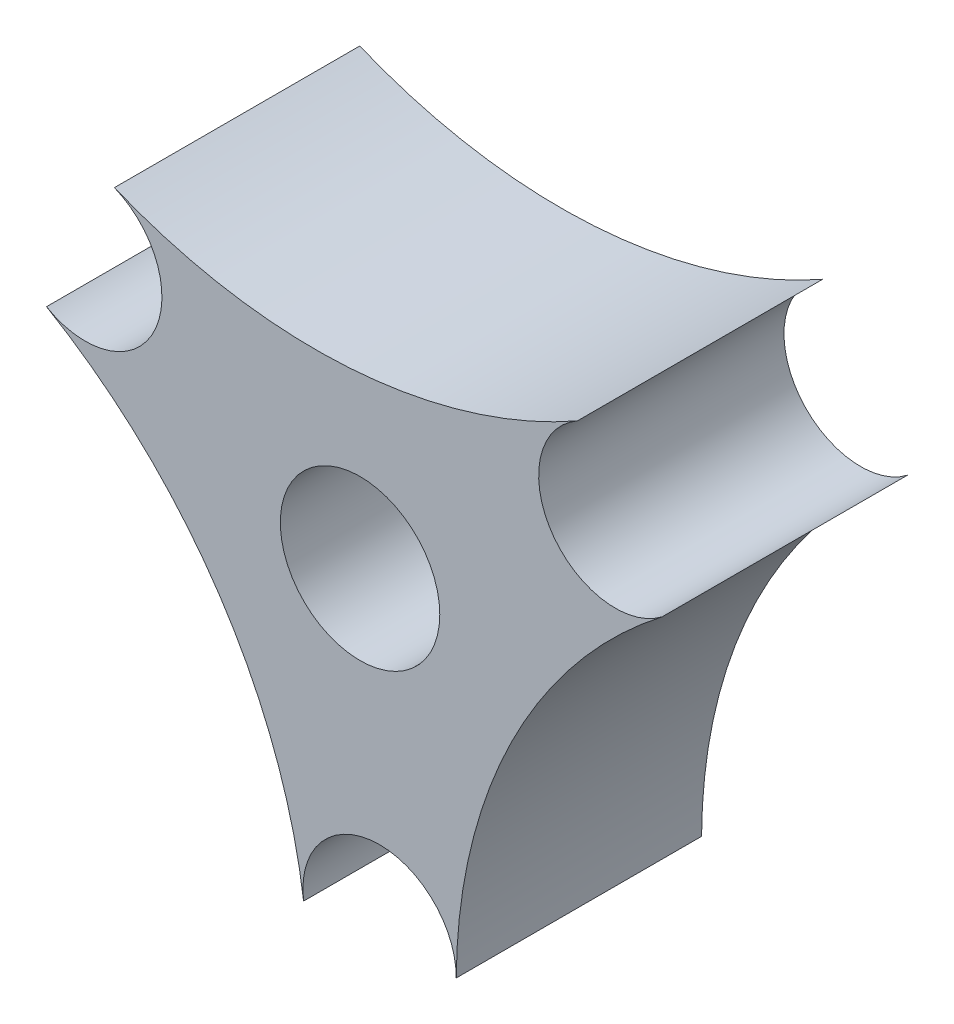
ISO-10303-21;
HEADER;
FILE_DESCRIPTION(('STEP AP214'),'2;1');
FILE_NAME('part.step','',(''),(''),'','','');
FILE_SCHEMA(('AUTOMOTIVE_DESIGN { 1 0 10303 214 1 1 1 1 }'));
ENDSEC;
DATA;
#1=APPLICATION_CONTEXT('core data for automotive mechanical design processes');
#2=APPLICATION_PROTOCOL_DEFINITION('international standard','automotive_design',2000,#1);
#3=PRODUCT_CONTEXT('',#1,'mechanical');
#4=PRODUCT('Part','Part','',(#3));
#5=PRODUCT_RELATED_PRODUCT_CATEGORY('part','',(#4));
#6=PRODUCT_DEFINITION_FORMATION('','',#4);
#7=PRODUCT_DEFINITION_CONTEXT('part definition',#1,'design');
#8=PRODUCT_DEFINITION('design','',#6,#7);
#9=PRODUCT_DEFINITION_SHAPE('','',#8);
#10=(LENGTH_UNIT() NAMED_UNIT(*) SI_UNIT(.MILLI.,.METRE.));
#11=(NAMED_UNIT(*) PLANE_ANGLE_UNIT() SI_UNIT($,.RADIAN.));
#12=(NAMED_UNIT(*) SI_UNIT($,.STERADIAN.) SOLID_ANGLE_UNIT());
#13=UNCERTAINTY_MEASURE_WITH_UNIT(LENGTH_MEASURE(1.E-05),#10,'distance_accuracy_value','');
#14=(GEOMETRIC_REPRESENTATION_CONTEXT(3) GLOBAL_UNCERTAINTY_ASSIGNED_CONTEXT((#13)) GLOBAL_UNIT_ASSIGNED_CONTEXT((#10,
#11,#12)) REPRESENTATION_CONTEXT('',''));
#15=CARTESIAN_POINT('',(0.,0.,0.));
#16=DIRECTION('',(0.,0.,1.));
#17=DIRECTION('',(1.,0.,0.));
#18=AXIS2_PLACEMENT_3D('',#15,#16,#17);
#19=CARTESIAN_POINT('',(408.244515982994,-202.20827326618,160.));
#20=DIRECTION('',(0.,0.,-1.));
#21=DIRECTION('',(-1.,0.,0.));
#22=AXIS2_PLACEMENT_3D('',#19,#20,#21);
#23=CYLINDRICAL_SURFACE('',#22,345.52);
#24=CARTESIAN_POINT('',(408.244515982994,-202.20827326618,0.));
#25=DIRECTION('',(0.,0.,1.));
#26=DIRECTION('',(1.,0.,0.));
#27=AXIS2_PLACEMENT_3D('',#24,#25,#26);
#28=CIRCLE('',#27,345.52);
#29=CARTESIAN_POINT('',(197.049087255945,71.2520735572632,0.));
#30=VERTEX_POINT('',#29);
#31=CARTESIAN_POINT('',(62.7320621801279,-199.924708701148,0.));
#32=VERTEX_POINT('',#31);
#33=EDGE_CURVE('E122',#30,#32,#28,.T.);
#34=ORIENTED_EDGE('',*,*,#33,.F.);
#35=DIRECTION('',(0.,0.,-1.));
#36=VECTOR('',#35,1.);
#37=CARTESIAN_POINT('',(197.049087255945,71.2520735572632,160.));
#38=LINE('',#37,#36);
#39=CARTESIAN_POINT('',(197.049087255945,71.2520735572632,160.));
#40=VERTEX_POINT('',#39);
#41=EDGE_CURVE('E11',#40,#30,#38,.T.);
#42=ORIENTED_EDGE('',*,*,#41,.F.);
#43=CARTESIAN_POINT('',(408.244515982994,-202.20827326618,160.));
#44=DIRECTION('',(0.,0.,1.));
#45=DIRECTION('',(1.,0.,0.));
#46=AXIS2_PLACEMENT_3D('',#43,#44,#45);
#47=CIRCLE('',#46,345.52);
#48=CARTESIAN_POINT('',(62.7320621801279,-199.924708701148,160.));
#49=VERTEX_POINT('',#48);
#50=EDGE_CURVE('E244',#40,#49,#47,.T.);
#51=ORIENTED_EDGE('',*,*,#50,.T.);
#52=DIRECTION('',(0.,0.,-1.));
#53=VECTOR('',#52,1.);
#54=CARTESIAN_POINT('',(62.7320621801279,-199.924708701148,160.));
#55=LINE('',#54,#53);
#56=EDGE_CURVE('E54',#49,#32,#55,.T.);
#57=ORIENTED_EDGE('',*,*,#56,.T.);
#58=EDGE_LOOP('',(#34,#42,#51,#57));
#59=FACE_BOUND('',#58,.T.);
#60=ADVANCED_FACE('F37',(#59),#23,.F.);
#61=CARTESIAN_POINT('',(166.487118523737,110.824362690084,160.));
#62=DIRECTION('',(0.,0.,-1.));
#63=DIRECTION('',(-1.,0.,0.));
#64=AXIS2_PLACEMENT_3D('',#61,#62,#63);
#65=CYLINDRICAL_SURFACE('',#64,50.);
#66=CARTESIAN_POINT('',(166.487118523737,110.824362690084,0.));
#67=DIRECTION('',(0.,0.,1.));
#68=DIRECTION('',(1.,0.,0.));
#69=AXIS2_PLACEMENT_3D('',#66,#67,#68);
#70=CIRCLE('',#69,50.);
#71=CARTESIAN_POINT('',(141.773845489334,154.28991383035,0.));
#72=VERTEX_POINT('',#71);
#73=EDGE_CURVE('E124',#72,#30,#70,.T.);
#74=ORIENTED_EDGE('',*,*,#73,.F.);
#75=DIRECTION('',(0.,0.,-1.));
#76=VECTOR('',#75,1.);
#77=CARTESIAN_POINT('',(141.773845489334,154.28991383035,160.));
#78=LINE('',#77,#76);
#79=CARTESIAN_POINT('',(141.773845489334,154.28991383035,160.));
#80=VERTEX_POINT('',#79);
#81=EDGE_CURVE('E46',#80,#72,#78,.T.);
#82=ORIENTED_EDGE('',*,*,#81,.F.);
#83=CARTESIAN_POINT('',(166.487118523737,110.824362690084,160.));
#84=DIRECTION('',(0.,0.,1.));
#85=DIRECTION('',(1.,0.,0.));
#86=AXIS2_PLACEMENT_3D('',#83,#84,#85);
#87=CIRCLE('',#86,50.);
#88=EDGE_CURVE('E246',#80,#40,#87,.T.);
#89=ORIENTED_EDGE('',*,*,#88,.T.);
#90=ORIENTED_EDGE('',*,*,#41,.T.);
#91=EDGE_LOOP('',(#74,#82,#89,#90));
#92=FACE_BOUND('',#91,.T.);
#93=ADVANCED_FACE('F145',(#92),#65,.F.);
#94=CARTESIAN_POINT('',(-29.0047564875989,454.654258430045,160.));
#95=DIRECTION('',(0.,0.,-1.));
#96=DIRECTION('',(-1.,0.,0.));
#97=AXIS2_PLACEMENT_3D('',#94,#95,#96);
#98=CYLINDRICAL_SURFACE('',#97,345.52);
#99=CARTESIAN_POINT('',(-29.0047564875989,454.654258430045,0.));
#100=DIRECTION('',(0.,0.,1.));
#101=DIRECTION('',(1.,0.,0.));
#102=AXIS2_PLACEMENT_3D('',#99,#100,#101);
#103=CIRCLE('',#102,345.52);
#104=CARTESIAN_POINT('',(-160.23064940088,135.023478577553,0.));
#105=VERTEX_POINT('',#104);
#106=EDGE_CURVE('E127',#105,#72,#103,.T.);
#107=ORIENTED_EDGE('',*,*,#106,.F.);
#108=DIRECTION('',(0.,0.,-1.));
#109=VECTOR('',#108,1.);
#110=CARTESIAN_POINT('',(-160.23064940088,135.023478577553,160.));
#111=LINE('',#110,#109);
#112=CARTESIAN_POINT('',(-160.23064940088,135.023478577553,160.));
#113=VERTEX_POINT('',#112);
#114=EDGE_CURVE('E101',#113,#105,#111,.T.);
#115=ORIENTED_EDGE('',*,*,#114,.F.);
#116=CARTESIAN_POINT('',(-29.0047564875989,454.654258430045,160.));
#117=DIRECTION('',(0.,0.,1.));
#118=DIRECTION('',(1.,0.,0.));
#119=AXIS2_PLACEMENT_3D('',#116,#117,#118);
#120=CIRCLE('',#119,345.52);
#121=EDGE_CURVE('E111',#113,#80,#120,.T.);
#122=ORIENTED_EDGE('',*,*,#121,.T.);
#123=ORIENTED_EDGE('',*,*,#81,.T.);
#124=EDGE_LOOP('',(#107,#115,#122,#123));
#125=FACE_BOUND('',#124,.T.);
#126=ADVANCED_FACE('F142',(#125),#98,.F.);
#127=CARTESIAN_POINT('',(-179.220272709701,88.7698926993848,160.));
#128=DIRECTION('',(0.,0.,-1.));
#129=DIRECTION('',(-1.,0.,0.));
#130=AXIS2_PLACEMENT_3D('',#127,#128,#129);
#131=CYLINDRICAL_SURFACE('',#130,50.);
#132=CARTESIAN_POINT('',(-179.220272709701,88.7698926993848,0.));
#133=DIRECTION('',(0.,0.,1.));
#134=DIRECTION('',(1.,0.,0.));
#135=AXIS2_PLACEMENT_3D('',#132,#133,#134);
#136=CIRCLE('',#135,50.);
#137=CARTESIAN_POINT('',(-204.505907669462,45.6347948707985,0.));
#138=VERTEX_POINT('',#137);
#139=EDGE_CURVE('E97',#138,#105,#136,.T.);
#140=ORIENTED_EDGE('',*,*,#139,.F.);
#141=DIRECTION('',(0.,0.,-1.));
#142=VECTOR('',#141,1.);
#143=CARTESIAN_POINT('',(-204.505907669462,45.6347948707985,160.));
#144=LINE('',#143,#142);
#145=CARTESIAN_POINT('',(-204.505907669462,45.6347948707985,160.));
#146=VERTEX_POINT('',#145);
#147=EDGE_CURVE('E92',#146,#138,#144,.T.);
#148=ORIENTED_EDGE('',*,*,#147,.F.);
#149=CARTESIAN_POINT('',(-179.220272709701,88.7698926993848,160.));
#150=DIRECTION('',(0.,0.,1.));
#151=DIRECTION('',(1.,0.,0.));
#152=AXIS2_PLACEMENT_3D('',#149,#150,#151);
#153=CIRCLE('',#152,50.);
#154=EDGE_CURVE('E95',#146,#113,#153,.T.);
#155=ORIENTED_EDGE('',*,*,#154,.T.);
#156=ORIENTED_EDGE('',*,*,#114,.T.);
#157=EDGE_LOOP('',(#140,#148,#155,#156));
#158=FACE_BOUND('',#157,.T.);
#159=ADVANCED_FACE('F94',(#158),#131,.F.);
#160=CARTESIAN_POINT('',(-379.239759495395,-252.445985163865,160.));
#161=DIRECTION('',(0.,0.,-1.));
#162=DIRECTION('',(-1.,0.,0.));
#163=AXIS2_PLACEMENT_3D('',#160,#161,#162);
#164=CYLINDRICAL_SURFACE('',#163,345.52);
#165=CARTESIAN_POINT('',(-379.239759495395,-252.445985163865,0.));
#166=DIRECTION('',(0.,0.,1.));
#167=DIRECTION('',(1.,0.,0.));
#168=AXIS2_PLACEMENT_3D('',#165,#166,#167);
#169=CIRCLE('',#168,345.52);
#170=CARTESIAN_POINT('',(-36.8184378550648,-206.275552134816,0.));
#171=VERTEX_POINT('',#170);
#172=EDGE_CURVE('E131',#171,#138,#169,.T.);
#173=ORIENTED_EDGE('',*,*,#172,.F.);
#174=DIRECTION('',(0.,0.,-1.));
#175=VECTOR('',#174,1.);
#176=CARTESIAN_POINT('',(-36.8184378550648,-206.275552134816,160.));
#177=LINE('',#176,#175);
#178=CARTESIAN_POINT('',(-36.8184378550648,-206.275552134816,160.));
#179=VERTEX_POINT('',#178);
#180=EDGE_CURVE('E73',#179,#171,#177,.T.);
#181=ORIENTED_EDGE('',*,*,#180,.F.);
#182=CARTESIAN_POINT('',(-379.239759495395,-252.445985163865,160.));
#183=DIRECTION('',(0.,0.,1.));
#184=DIRECTION('',(1.,0.,0.));
#185=AXIS2_PLACEMENT_3D('',#182,#183,#184);
#186=CIRCLE('',#185,345.52);
#187=EDGE_CURVE('E108',#179,#146,#186,.T.);
#188=ORIENTED_EDGE('',*,*,#187,.T.);
#189=ORIENTED_EDGE('',*,*,#147,.T.);
#190=EDGE_LOOP('',(#173,#181,#188,#189));
#191=FACE_BOUND('',#190,.T.);
#192=ADVANCED_FACE('F113',(#191),#164,.F.);
#193=CARTESIAN_POINT('',(0.,0.,160.));
#194=DIRECTION('',(0.,0.,-1.));
#195=DIRECTION('',(-1.,0.,0.));
#196=AXIS2_PLACEMENT_3D('',#193,#194,#195);
#197=CYLINDRICAL_SURFACE('',#196,52.);
#198=CARTESIAN_POINT('',(0.,0.,160.));
#199=DIRECTION('',(0.,0.,1.));
#200=DIRECTION('',(1.,0.,0.));
#201=AXIS2_PLACEMENT_3D('',#198,#199,#200);
#202=CIRCLE('',#201,52.);
#203=CARTESIAN_POINT('',(52.,0.,160.));
#204=VERTEX_POINT('',#203);
#205=EDGE_CURVE('E136',#204,#204,#202,.T.);
#206=ORIENTED_EDGE('',*,*,#205,.T.);
#207=EDGE_LOOP('',(#206));
#208=FACE_BOUND('',#207,.T.);
#209=CARTESIAN_POINT('',(0.,0.,0.));
#210=DIRECTION('',(0.,0.,1.));
#211=DIRECTION('',(1.,0.,0.));
#212=AXIS2_PLACEMENT_3D('',#209,#210,#211);
#213=CIRCLE('',#212,52.);
#214=CARTESIAN_POINT('',(52.,0.,0.));
#215=VERTEX_POINT('',#214);
#216=EDGE_CURVE('E119',#215,#215,#213,.T.);
#217=ORIENTED_EDGE('',*,*,#216,.F.);
#218=EDGE_LOOP('',(#217));
#219=FACE_BOUND('',#218,.T.);
#220=ADVANCED_FACE('F39',(#208,#219),#197,.F.);
#221=CARTESIAN_POINT('',(12.7331541859646,-199.594255389469,160.));
#222=DIRECTION('',(0.,0.,-1.));
#223=DIRECTION('',(-1.,0.,0.));
#224=AXIS2_PLACEMENT_3D('',#221,#222,#223);
#225=CYLINDRICAL_SURFACE('',#224,50.);
#226=CARTESIAN_POINT('',(12.7331541859646,-199.594255389469,0.));
#227=DIRECTION('',(0.,0.,1.));
#228=DIRECTION('',(1.,0.,0.));
#229=AXIS2_PLACEMENT_3D('',#226,#227,#228);
#230=CIRCLE('',#229,50.);
#231=EDGE_CURVE('E133',#32,#171,#230,.T.);
#232=ORIENTED_EDGE('',*,*,#231,.F.);
#233=ORIENTED_EDGE('',*,*,#56,.F.);
#234=CARTESIAN_POINT('',(12.7331541859646,-199.594255389469,160.));
#235=DIRECTION('',(0.,0.,1.));
#236=DIRECTION('',(1.,0.,0.));
#237=AXIS2_PLACEMENT_3D('',#234,#235,#236);
#238=CIRCLE('',#237,50.);
#239=EDGE_CURVE('E114',#49,#179,#238,.T.);
#240=ORIENTED_EDGE('',*,*,#239,.T.);
#241=ORIENTED_EDGE('',*,*,#180,.T.);
#242=EDGE_LOOP('',(#232,#233,#240,#241));
#243=FACE_BOUND('',#242,.T.);
#244=ADVANCED_FACE('F148',(#243),#225,.F.);
#245=CARTESIAN_POINT('',(0.,0.,160.));
#246=DIRECTION('',(0.,0.,1.));
#247=DIRECTION('',(1.,0.,0.));
#248=AXIS2_PLACEMENT_3D('',#245,#246,#247);
#249=PLANE('',#248);
#250=ORIENTED_EDGE('',*,*,#205,.F.);
#251=EDGE_LOOP('',(#250));
#252=FACE_BOUND('',#251,.T.);
#253=ORIENTED_EDGE('',*,*,#50,.F.);
#254=ORIENTED_EDGE('',*,*,#88,.F.);
#255=ORIENTED_EDGE('',*,*,#121,.F.);
#256=ORIENTED_EDGE('',*,*,#154,.F.);
#257=ORIENTED_EDGE('',*,*,#187,.F.);
#258=ORIENTED_EDGE('',*,*,#239,.F.);
#259=EDGE_LOOP('',(#253,#254,#255,#256,#257,#258));
#260=FACE_BOUND('',#259,.T.);
#261=ADVANCED_FACE('F106',(#252,#260),#249,.T.);
#262=CARTESIAN_POINT('',(0.,0.,0.));
#263=DIRECTION('',(0.,0.,1.));
#264=DIRECTION('',(1.,0.,0.));
#265=AXIS2_PLACEMENT_3D('',#262,#263,#264);
#266=PLANE('',#265);
#267=ORIENTED_EDGE('',*,*,#216,.T.);
#268=EDGE_LOOP('',(#267));
#269=FACE_BOUND('',#268,.T.);
#270=ORIENTED_EDGE('',*,*,#33,.T.);
#271=ORIENTED_EDGE('',*,*,#231,.T.);
#272=ORIENTED_EDGE('',*,*,#172,.T.);
#273=ORIENTED_EDGE('',*,*,#139,.T.);
#274=ORIENTED_EDGE('',*,*,#106,.T.);
#275=ORIENTED_EDGE('',*,*,#73,.T.);
#276=EDGE_LOOP('',(#270,#271,#272,#273,#274,#275));
#277=FACE_BOUND('',#276,.T.);
#278=ADVANCED_FACE('F147',(#269,#277),#266,.F.);
#279=CLOSED_SHELL('',(#60,#93,#126,#159,#192,#220,#244,#261,#278));
#280=MANIFOLD_SOLID_BREP('B2',#279);
#281=ADVANCED_BREP_SHAPE_REPRESENTATION('',(#18,#280),#14);
#282=SHAPE_DEFINITION_REPRESENTATION(#9,#281);
ENDSEC;
END-ISO-10303-21;
